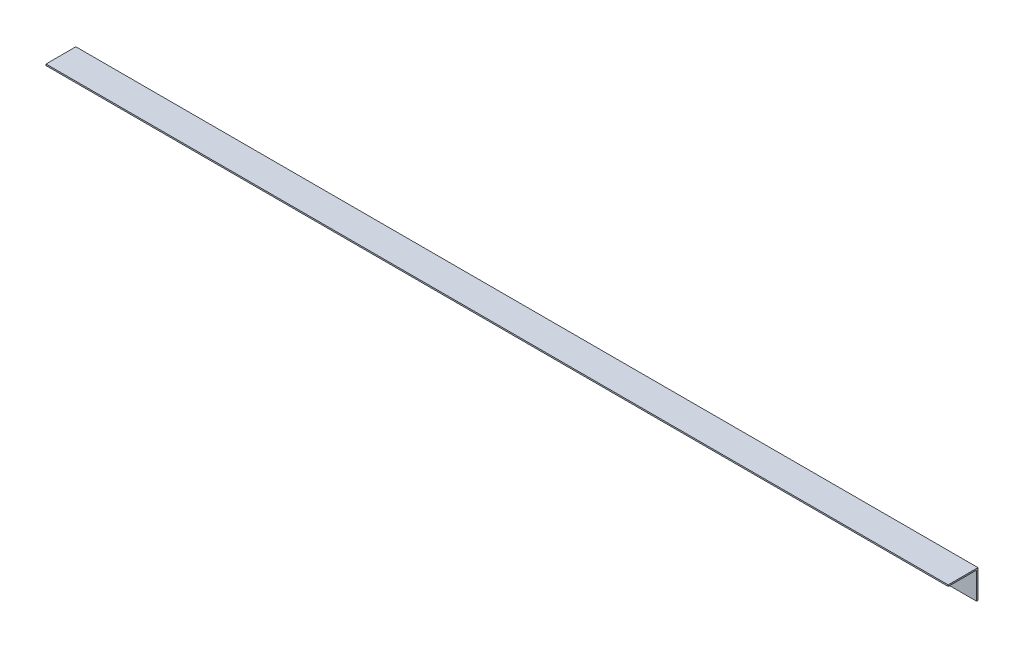
ISO-10303-21;
HEADER;
FILE_DESCRIPTION(('STEP AP214'),'2;1');
FILE_NAME('part.step','',(''),(''),'','','');
FILE_SCHEMA(('AUTOMOTIVE_DESIGN { 1 0 10303 214 1 1 1 1 }'));
ENDSEC;
DATA;
#1=APPLICATION_CONTEXT('core data for automotive mechanical design processes');
#2=APPLICATION_PROTOCOL_DEFINITION('international standard','automotive_design',2000,#1);
#3=PRODUCT_CONTEXT('',#1,'mechanical');
#4=PRODUCT('Part','Part','',(#3));
#5=PRODUCT_RELATED_PRODUCT_CATEGORY('part','',(#4));
#6=PRODUCT_DEFINITION_FORMATION('','',#4);
#7=PRODUCT_DEFINITION_CONTEXT('part definition',#1,'design');
#8=PRODUCT_DEFINITION('design','',#6,#7);
#9=PRODUCT_DEFINITION_SHAPE('','',#8);
#10=(LENGTH_UNIT() NAMED_UNIT(*) SI_UNIT(.MILLI.,.METRE.));
#11=(NAMED_UNIT(*) PLANE_ANGLE_UNIT() SI_UNIT($,.RADIAN.));
#12=(NAMED_UNIT(*) SI_UNIT($,.STERADIAN.) SOLID_ANGLE_UNIT());
#13=UNCERTAINTY_MEASURE_WITH_UNIT(LENGTH_MEASURE(1.E-05),#10,'distance_accuracy_value','');
#14=(GEOMETRIC_REPRESENTATION_CONTEXT(3) GLOBAL_UNCERTAINTY_ASSIGNED_CONTEXT((#13)) GLOBAL_UNIT_ASSIGNED_CONTEXT((#10,
#11,#12)) REPRESENTATION_CONTEXT('',''));
#15=CARTESIAN_POINT('',(0.,0.,0.));
#16=DIRECTION('',(0.,0.,1.));
#17=DIRECTION('',(1.,0.,0.));
#18=AXIS2_PLACEMENT_3D('',#15,#16,#17);
#19=CARTESIAN_POINT('',(0.,0.,1.));
#20=DIRECTION('',(0.,0.,-1.));
#21=DIRECTION('',(-1.,0.,0.));
#22=AXIS2_PLACEMENT_3D('',#19,#20,#21);
#23=PLANE('',#22);
#24=DIRECTION('',(1.,0.,0.));
#25=VECTOR('',#24,1.);
#26=CARTESIAN_POINT('',(0.,19.,1.));
#27=LINE('',#26,#25);
#28=CARTESIAN_POINT('',(0.,19.,1.));
#29=VERTEX_POINT('',#28);
#30=CARTESIAN_POINT('',(635.,19.,1.));
#31=VERTEX_POINT('',#30);
#32=EDGE_CURVE('E48',#29,#31,#27,.T.);
#33=ORIENTED_EDGE('',*,*,#32,.F.);
#34=DIRECTION('',(0.,-1.,0.));
#35=VECTOR('',#34,1.);
#36=CARTESIAN_POINT('',(0.,0.,1.));
#37=LINE('',#36,#35);
#38=CARTESIAN_POINT('',(0.,0.,1.));
#39=VERTEX_POINT('',#38);
#40=EDGE_CURVE('E85',#29,#39,#37,.T.);
#41=ORIENTED_EDGE('',*,*,#40,.T.);
#42=DIRECTION('',(1.,0.,0.));
#43=VECTOR('',#42,1.);
#44=CARTESIAN_POINT('',(0.,0.,1.));
#45=LINE('',#44,#43);
#46=CARTESIAN_POINT('',(635.,0.,1.));
#47=VERTEX_POINT('',#46);
#48=EDGE_CURVE('E54',#39,#47,#45,.T.);
#49=ORIENTED_EDGE('',*,*,#48,.T.);
#50=DIRECTION('',(0.,1.,0.));
#51=VECTOR('',#50,1.);
#52=CARTESIAN_POINT('',(635.,0.,1.));
#53=LINE('',#52,#51);
#54=EDGE_CURVE('E96',#47,#31,#53,.T.);
#55=ORIENTED_EDGE('',*,*,#54,.T.);
#56=EDGE_LOOP('',(#33,#41,#49,#55));
#57=FACE_BOUND('',#56,.T.);
#58=ADVANCED_FACE('F33',(#57),#23,.F.);
#59=CARTESIAN_POINT('',(0.,0.,1.));
#60=DIRECTION('',(1.,0.,0.));
#61=DIRECTION('',(0.,0.,-1.));
#62=AXIS2_PLACEMENT_3D('',#59,#60,#61);
#63=PLANE('',#62);
#64=DIRECTION('',(0.,-1.,0.));
#65=VECTOR('',#64,1.);
#66=CARTESIAN_POINT('',(0.,0.,0.));
#67=LINE('',#66,#65);
#68=CARTESIAN_POINT('',(0.,20.,0.));
#69=VERTEX_POINT('',#68);
#70=CARTESIAN_POINT('',(0.,0.,0.));
#71=VERTEX_POINT('',#70);
#72=EDGE_CURVE('E92',#69,#71,#67,.T.);
#73=ORIENTED_EDGE('',*,*,#72,.T.);
#74=DIRECTION('',(0.,0.,-1.));
#75=VECTOR('',#74,1.);
#76=CARTESIAN_POINT('',(0.,0.,1.));
#77=LINE('',#76,#75);
#78=EDGE_CURVE('E11',#39,#71,#77,.T.);
#79=ORIENTED_EDGE('',*,*,#78,.F.);
#80=ORIENTED_EDGE('',*,*,#40,.F.);
#81=DIRECTION('',(0.,0.,-1.));
#82=VECTOR('',#81,1.);
#83=CARTESIAN_POINT('',(0.,19.,21.));
#84=LINE('',#83,#82);
#85=CARTESIAN_POINT('',(0.,19.,21.));
#86=VERTEX_POINT('',#85);
#87=EDGE_CURVE('E100',#86,#29,#84,.T.);
#88=ORIENTED_EDGE('',*,*,#87,.F.);
#89=DIRECTION('',(0.,-1.,0.));
#90=VECTOR('',#89,1.);
#91=CARTESIAN_POINT('',(0.,20.,21.));
#92=LINE('',#91,#90);
#93=CARTESIAN_POINT('',(0.,20.,21.));
#94=VERTEX_POINT('',#93);
#95=EDGE_CURVE('E95',#94,#86,#92,.T.);
#96=ORIENTED_EDGE('',*,*,#95,.F.);
#97=DIRECTION('',(0.,0.,-1.));
#98=VECTOR('',#97,1.);
#99=CARTESIAN_POINT('',(0.,20.,1.));
#100=LINE('',#99,#98);
#101=EDGE_CURVE('E78',#94,#69,#100,.T.);
#102=ORIENTED_EDGE('',*,*,#101,.T.);
#103=EDGE_LOOP('',(#73,#79,#80,#88,#96,#102));
#104=FACE_BOUND('',#103,.T.);
#105=ADVANCED_FACE('F35',(#104),#63,.F.);
#106=CARTESIAN_POINT('',(0.,0.,1.));
#107=DIRECTION('',(0.,1.,0.));
#108=DIRECTION('',(0.,0.,1.));
#109=AXIS2_PLACEMENT_3D('',#106,#107,#108);
#110=PLANE('',#109);
#111=DIRECTION('',(1.,0.,0.));
#112=VECTOR('',#111,1.);
#113=CARTESIAN_POINT('',(0.,0.,0.));
#114=LINE('',#113,#112);
#115=CARTESIAN_POINT('',(635.,0.,0.));
#116=VERTEX_POINT('',#115);
#117=EDGE_CURVE('E99',#71,#116,#114,.T.);
#118=ORIENTED_EDGE('',*,*,#117,.T.);
#119=DIRECTION('',(0.,0.,-1.));
#120=VECTOR('',#119,1.);
#121=CARTESIAN_POINT('',(635.,0.,1.));
#122=LINE('',#121,#120);
#123=EDGE_CURVE('E41',#47,#116,#122,.T.);
#124=ORIENTED_EDGE('',*,*,#123,.F.);
#125=ORIENTED_EDGE('',*,*,#48,.F.);
#126=ORIENTED_EDGE('',*,*,#78,.T.);
#127=EDGE_LOOP('',(#118,#124,#125,#126));
#128=FACE_BOUND('',#127,.T.);
#129=ADVANCED_FACE('F116',(#128),#110,.F.);
#130=CARTESIAN_POINT('',(635.,0.,1.));
#131=DIRECTION('',(-1.,0.,0.));
#132=DIRECTION('',(0.,0.,1.));
#133=AXIS2_PLACEMENT_3D('',#130,#131,#132);
#134=PLANE('',#133);
#135=DIRECTION('',(0.,1.,0.));
#136=VECTOR('',#135,1.);
#137=CARTESIAN_POINT('',(635.,0.,0.));
#138=LINE('',#137,#136);
#139=CARTESIAN_POINT('',(635.,20.,0.));
#140=VERTEX_POINT('',#139);
#141=EDGE_CURVE('E86',#116,#140,#138,.T.);
#142=ORIENTED_EDGE('',*,*,#141,.T.);
#143=DIRECTION('',(0.,0.,-1.));
#144=VECTOR('',#143,1.);
#145=CARTESIAN_POINT('',(635.,20.,1.));
#146=LINE('',#145,#144);
#147=CARTESIAN_POINT('',(635.,20.,21.));
#148=VERTEX_POINT('',#147);
#149=EDGE_CURVE('E81',#148,#140,#146,.T.);
#150=ORIENTED_EDGE('',*,*,#149,.F.);
#151=DIRECTION('',(0.,1.,0.));
#152=VECTOR('',#151,1.);
#153=CARTESIAN_POINT('',(635.,20.,21.));
#154=LINE('',#153,#152);
#155=CARTESIAN_POINT('',(635.,19.,21.));
#156=VERTEX_POINT('',#155);
#157=EDGE_CURVE('E131',#156,#148,#154,.T.);
#158=ORIENTED_EDGE('',*,*,#157,.F.);
#159=DIRECTION('',(0.,0.,-1.));
#160=VECTOR('',#159,1.);
#161=CARTESIAN_POINT('',(635.,19.,21.));
#162=LINE('',#161,#160);
#163=EDGE_CURVE('E104',#156,#31,#162,.T.);
#164=ORIENTED_EDGE('',*,*,#163,.T.);
#165=ORIENTED_EDGE('',*,*,#54,.F.);
#166=ORIENTED_EDGE('',*,*,#123,.T.);
#167=EDGE_LOOP('',(#142,#150,#158,#164,#165,#166));
#168=FACE_BOUND('',#167,.T.);
#169=ADVANCED_FACE('F113',(#168),#134,.F.);
#170=CARTESIAN_POINT('',(0.,20.,1.));
#171=DIRECTION('',(0.,-1.,0.));
#172=DIRECTION('',(0.,0.,-1.));
#173=AXIS2_PLACEMENT_3D('',#170,#171,#172);
#174=PLANE('',#173);
#175=DIRECTION('',(-1.,0.,0.));
#176=VECTOR('',#175,1.);
#177=CARTESIAN_POINT('',(0.,20.,0.));
#178=LINE('',#177,#176);
#179=EDGE_CURVE('E74',#140,#69,#178,.T.);
#180=ORIENTED_EDGE('',*,*,#179,.T.);
#181=ORIENTED_EDGE('',*,*,#101,.F.);
#182=DIRECTION('',(-1.,0.,0.));
#183=VECTOR('',#182,1.);
#184=CARTESIAN_POINT('',(0.,20.,21.));
#185=LINE('',#184,#183);
#186=EDGE_CURVE('E134',#148,#94,#185,.T.);
#187=ORIENTED_EDGE('',*,*,#186,.F.);
#188=ORIENTED_EDGE('',*,*,#149,.T.);
#189=EDGE_LOOP('',(#180,#181,#187,#188));
#190=FACE_BOUND('',#189,.T.);
#191=ADVANCED_FACE('F76',(#190),#174,.F.);
#192=CARTESIAN_POINT('',(0.,0.,0.));
#193=DIRECTION('',(0.,0.,-1.));
#194=DIRECTION('',(-1.,0.,0.));
#195=AXIS2_PLACEMENT_3D('',#192,#193,#194);
#196=PLANE('',#195);
#197=ORIENTED_EDGE('',*,*,#72,.F.);
#198=ORIENTED_EDGE('',*,*,#179,.F.);
#199=ORIENTED_EDGE('',*,*,#141,.F.);
#200=ORIENTED_EDGE('',*,*,#117,.F.);
#201=EDGE_LOOP('',(#197,#198,#199,#200));
#202=FACE_BOUND('',#201,.T.);
#203=ADVANCED_FACE('F98',(#202),#196,.T.);
#204=CARTESIAN_POINT('',(0.,19.,21.));
#205=DIRECTION('',(0.,1.,0.));
#206=DIRECTION('',(0.,0.,1.));
#207=AXIS2_PLACEMENT_3D('',#204,#205,#206);
#208=PLANE('',#207);
#209=ORIENTED_EDGE('',*,*,#32,.T.);
#210=ORIENTED_EDGE('',*,*,#163,.F.);
#211=DIRECTION('',(1.,0.,0.));
#212=VECTOR('',#211,1.);
#213=CARTESIAN_POINT('',(0.,19.,21.));
#214=LINE('',#213,#212);
#215=EDGE_CURVE('E125',#86,#156,#214,.T.);
#216=ORIENTED_EDGE('',*,*,#215,.F.);
#217=ORIENTED_EDGE('',*,*,#87,.T.);
#218=EDGE_LOOP('',(#209,#210,#216,#217));
#219=FACE_BOUND('',#218,.T.);
#220=ADVANCED_FACE('F121',(#219),#208,.F.);
#221=CARTESIAN_POINT('',(0.,0.,21.));
#222=DIRECTION('',(0.,0.,1.));
#223=DIRECTION('',(1.,0.,0.));
#224=AXIS2_PLACEMENT_3D('',#221,#222,#223);
#225=PLANE('',#224);
#226=ORIENTED_EDGE('',*,*,#95,.T.);
#227=ORIENTED_EDGE('',*,*,#215,.T.);
#228=ORIENTED_EDGE('',*,*,#157,.T.);
#229=ORIENTED_EDGE('',*,*,#186,.T.);
#230=EDGE_LOOP('',(#226,#227,#228,#229));
#231=FACE_BOUND('',#230,.T.);
#232=ADVANCED_FACE('F133',(#231),#225,.T.);
#233=CLOSED_SHELL('',(#58,#105,#129,#169,#191,#203,#220,#232));
#234=MANIFOLD_SOLID_BREP('B2',#233);
#235=ADVANCED_BREP_SHAPE_REPRESENTATION('',(#18,#234),#14);
#236=SHAPE_DEFINITION_REPRESENTATION(#9,#235);
ENDSEC;
END-ISO-10303-21;
